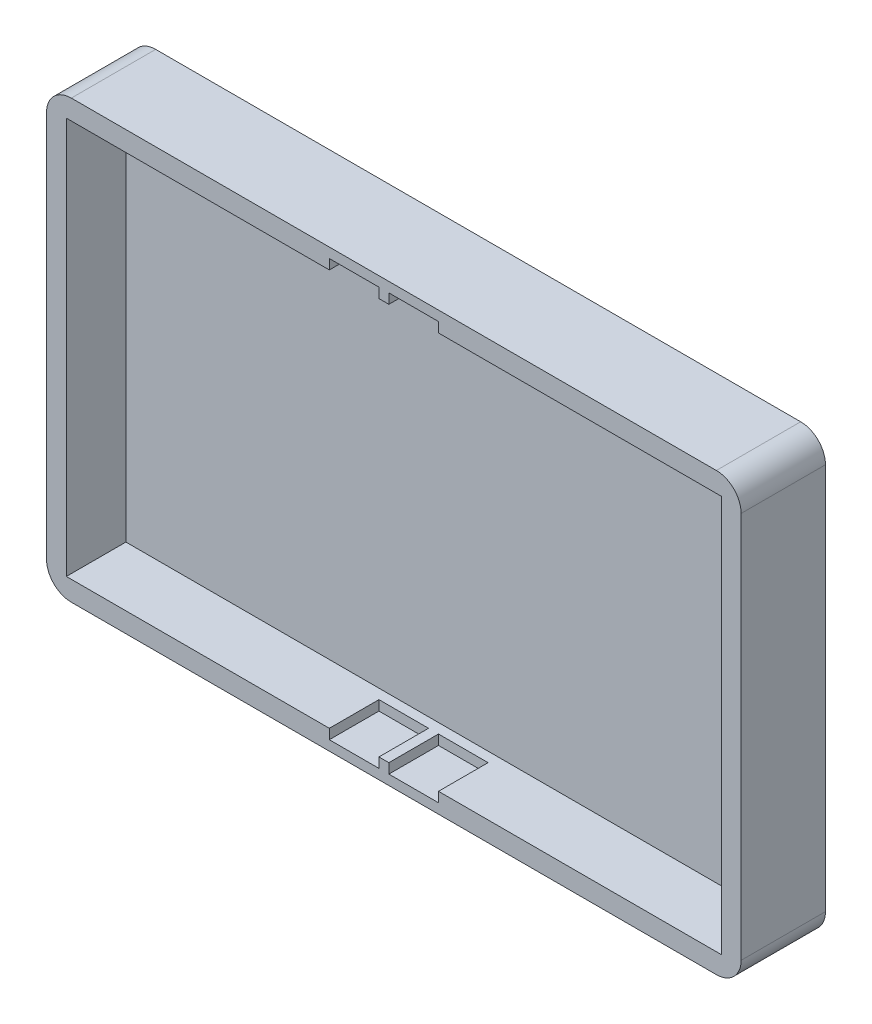
ISO-10303-21;
HEADER;
FILE_DESCRIPTION(('STEP AP214'),'2;1');
FILE_NAME('part.step','',(''),(''),'','','');
FILE_SCHEMA(('AUTOMOTIVE_DESIGN { 1 0 10303 214 1 1 1 1 }'));
ENDSEC;
DATA;
#1=APPLICATION_CONTEXT('core data for automotive mechanical design processes');
#2=APPLICATION_PROTOCOL_DEFINITION('international standard','automotive_design',2000,#1);
#3=PRODUCT_CONTEXT('',#1,'mechanical');
#4=PRODUCT('Part','Part','',(#3));
#5=PRODUCT_RELATED_PRODUCT_CATEGORY('part','',(#4));
#6=PRODUCT_DEFINITION_FORMATION('','',#4);
#7=PRODUCT_DEFINITION_CONTEXT('part definition',#1,'design');
#8=PRODUCT_DEFINITION('design','',#6,#7);
#9=PRODUCT_DEFINITION_SHAPE('','',#8);
#10=(LENGTH_UNIT() NAMED_UNIT(*) SI_UNIT(.MILLI.,.METRE.));
#11=(NAMED_UNIT(*) PLANE_ANGLE_UNIT() SI_UNIT($,.RADIAN.));
#12=(NAMED_UNIT(*) SI_UNIT($,.STERADIAN.) SOLID_ANGLE_UNIT());
#13=UNCERTAINTY_MEASURE_WITH_UNIT(LENGTH_MEASURE(1.E-05),#10,'distance_accuracy_value','');
#14=(GEOMETRIC_REPRESENTATION_CONTEXT(3) GLOBAL_UNCERTAINTY_ASSIGNED_CONTEXT((#13)) GLOBAL_UNIT_ASSIGNED_CONTEXT((#10,
#11,#12)) REPRESENTATION_CONTEXT('',''));
#15=CARTESIAN_POINT('',(0.,0.,0.));
#16=DIRECTION('',(0.,0.,1.));
#17=DIRECTION('',(1.,0.,0.));
#18=AXIS2_PLACEMENT_3D('',#15,#16,#17);
#19=CARTESIAN_POINT('',(68.,2.,2.5));
#20=DIRECTION('',(0.,-1.,0.));
#21=DIRECTION('',(1.,0.,0.));
#22=AXIS2_PLACEMENT_3D('',#19,#20,#21);
#23=PLANE('',#22);
#24=DIRECTION('',(1.,0.,0.));
#25=VECTOR('',#24,1.);
#26=CARTESIAN_POINT('',(68.,2.,8.5));
#27=LINE('',#26,#25);
#28=CARTESIAN_POINT('',(33.5,2.,8.5));
#29=VERTEX_POINT('',#28);
#30=CARTESIAN_POINT('',(34.5,2.,8.5));
#31=VERTEX_POINT('',#30);
#32=EDGE_CURVE('E406',#29,#31,#27,.T.);
#33=ORIENTED_EDGE('',*,*,#32,.T.);
#34=DIRECTION('',(0.,0.,1.));
#35=VECTOR('',#34,1.);
#36=CARTESIAN_POINT('',(34.5,2.,2.5));
#37=LINE('',#36,#35);
#38=CARTESIAN_POINT('',(34.5,2.,3.5));
#39=VERTEX_POINT('',#38);
#40=EDGE_CURVE('E358',#39,#31,#37,.T.);
#41=ORIENTED_EDGE('',*,*,#40,.F.);
#42=DIRECTION('',(-1.,0.,0.));
#43=VECTOR('',#42,1.);
#44=CARTESIAN_POINT('',(68.,2.,3.50000000000001));
#45=LINE('',#44,#43);
#46=CARTESIAN_POINT('',(39.5,2.,3.5));
#47=VERTEX_POINT('',#46);
#48=EDGE_CURVE('E355',#47,#39,#45,.T.);
#49=ORIENTED_EDGE('',*,*,#48,.F.);
#50=DIRECTION('',(0.,0.,-1.));
#51=VECTOR('',#50,1.);
#52=CARTESIAN_POINT('',(39.5,2.,2.5));
#53=LINE('',#52,#51);
#54=CARTESIAN_POINT('',(39.5,2.,8.5));
#55=VERTEX_POINT('',#54);
#56=EDGE_CURVE('E324',#55,#47,#53,.T.);
#57=ORIENTED_EDGE('',*,*,#56,.F.);
#58=CARTESIAN_POINT('',(68.,2.,8.5));
#59=VERTEX_POINT('',#58);
#60=EDGE_CURVE('E402',#55,#59,#27,.T.);
#61=ORIENTED_EDGE('',*,*,#60,.T.);
#62=DIRECTION('',(0.,0.,1.));
#63=VECTOR('',#62,1.);
#64=CARTESIAN_POINT('',(68.,2.,2.5));
#65=LINE('',#64,#63);
#66=CARTESIAN_POINT('',(68.,2.,2.5));
#67=VERTEX_POINT('',#66);
#68=EDGE_CURVE('E407',#67,#59,#65,.T.);
#69=ORIENTED_EDGE('',*,*,#68,.F.);
#70=DIRECTION('',(1.,0.,0.));
#71=VECTOR('',#70,1.);
#72=CARTESIAN_POINT('',(68.,2.,2.5));
#73=LINE('',#72,#71);
#74=CARTESIAN_POINT('',(2.,1.99999999999999,2.5));
#75=VERTEX_POINT('',#74);
#76=EDGE_CURVE('E385',#75,#67,#73,.T.);
#77=ORIENTED_EDGE('',*,*,#76,.F.);
#78=DIRECTION('',(0.,0.,1.));
#79=VECTOR('',#78,1.);
#80=CARTESIAN_POINT('',(2.,1.99999999999999,2.5));
#81=LINE('',#80,#79);
#82=CARTESIAN_POINT('',(2.,1.99999999999999,8.5));
#83=VERTEX_POINT('',#82);
#84=EDGE_CURVE('E412',#75,#83,#81,.T.);
#85=ORIENTED_EDGE('',*,*,#84,.T.);
#86=CARTESIAN_POINT('',(28.5,2.,8.5));
#87=VERTEX_POINT('',#86);
#88=EDGE_CURVE('E377',#83,#87,#27,.T.);
#89=ORIENTED_EDGE('',*,*,#88,.T.);
#90=DIRECTION('',(0.,0.,1.));
#91=VECTOR('',#90,1.);
#92=CARTESIAN_POINT('',(28.5,2.,2.5));
#93=LINE('',#92,#91);
#94=CARTESIAN_POINT('',(28.5,2.,3.5));
#95=VERTEX_POINT('',#94);
#96=EDGE_CURVE('E364',#95,#87,#93,.T.);
#97=ORIENTED_EDGE('',*,*,#96,.F.);
#98=DIRECTION('',(-1.,0.,0.));
#99=VECTOR('',#98,1.);
#100=CARTESIAN_POINT('',(68.,2.,3.50000000000001));
#101=LINE('',#100,#99);
#102=CARTESIAN_POINT('',(33.5,2.,3.5));
#103=VERTEX_POINT('',#102);
#104=EDGE_CURVE('E361',#103,#95,#101,.T.);
#105=ORIENTED_EDGE('',*,*,#104,.F.);
#106=DIRECTION('',(0.,0.,-1.));
#107=VECTOR('',#106,1.);
#108=CARTESIAN_POINT('',(33.5,2.,2.5));
#109=LINE('',#108,#107);
#110=EDGE_CURVE('E367',#29,#103,#109,.T.);
#111=ORIENTED_EDGE('',*,*,#110,.F.);
#112=EDGE_LOOP('',(#33,#41,#49,#57,#61,#69,#77,#85,#89,#97,#105,#111));
#113=FACE_BOUND('',#112,.T.);
#114=ADVANCED_FACE('F43',(#113),#23,.F.);
#115=CARTESIAN_POINT('',(68.,42.,2.5));
#116=DIRECTION('',(0.,1.,0.));
#117=DIRECTION('',(-1.,0.,0.));
#118=AXIS2_PLACEMENT_3D('',#115,#116,#117);
#119=PLANE('',#118);
#120=DIRECTION('',(0.,0.,-1.));
#121=VECTOR('',#120,1.);
#122=CARTESIAN_POINT('',(28.5,42.,2.5));
#123=LINE('',#122,#121);
#124=CARTESIAN_POINT('',(28.5,42.,8.5));
#125=VERTEX_POINT('',#124);
#126=CARTESIAN_POINT('',(28.5,42.,3.5));
#127=VERTEX_POINT('',#126);
#128=EDGE_CURVE('E463',#125,#127,#123,.T.);
#129=ORIENTED_EDGE('',*,*,#128,.F.);
#130=DIRECTION('',(-1.,0.,0.));
#131=VECTOR('',#130,1.);
#132=CARTESIAN_POINT('',(68.,42.,8.5));
#133=LINE('',#132,#131);
#134=CARTESIAN_POINT('',(2.,42.,8.5));
#135=VERTEX_POINT('',#134);
#136=EDGE_CURVE('E392',#125,#135,#133,.T.);
#137=ORIENTED_EDGE('',*,*,#136,.T.);
#138=DIRECTION('',(0.,0.,1.));
#139=VECTOR('',#138,1.);
#140=CARTESIAN_POINT('',(2.,42.,2.5));
#141=LINE('',#140,#139);
#142=CARTESIAN_POINT('',(2.,42.,2.5));
#143=VERTEX_POINT('',#142);
#144=EDGE_CURVE('E415',#143,#135,#141,.T.);
#145=ORIENTED_EDGE('',*,*,#144,.F.);
#146=DIRECTION('',(-1.,0.,0.));
#147=VECTOR('',#146,1.);
#148=CARTESIAN_POINT('',(68.,42.,2.5));
#149=LINE('',#148,#147);
#150=CARTESIAN_POINT('',(68.,42.,2.5));
#151=VERTEX_POINT('',#150);
#152=EDGE_CURVE('E376',#151,#143,#149,.T.);
#153=ORIENTED_EDGE('',*,*,#152,.F.);
#154=DIRECTION('',(0.,0.,1.));
#155=VECTOR('',#154,1.);
#156=CARTESIAN_POINT('',(68.,42.,2.5));
#157=LINE('',#156,#155);
#158=CARTESIAN_POINT('',(68.,42.,8.5));
#159=VERTEX_POINT('',#158);
#160=EDGE_CURVE('E389',#151,#159,#157,.T.);
#161=ORIENTED_EDGE('',*,*,#160,.T.);
#162=CARTESIAN_POINT('',(39.5,42.,8.5));
#163=VERTEX_POINT('',#162);
#164=EDGE_CURVE('E393',#159,#163,#133,.T.);
#165=ORIENTED_EDGE('',*,*,#164,.T.);
#166=DIRECTION('',(0.,0.,1.));
#167=VECTOR('',#166,1.);
#168=CARTESIAN_POINT('',(39.5,42.,2.5));
#169=LINE('',#168,#167);
#170=CARTESIAN_POINT('',(39.5,42.,3.5));
#171=VERTEX_POINT('',#170);
#172=EDGE_CURVE('E437',#171,#163,#169,.T.);
#173=ORIENTED_EDGE('',*,*,#172,.F.);
#174=DIRECTION('',(1.,0.,0.));
#175=VECTOR('',#174,1.);
#176=CARTESIAN_POINT('',(68.,42.,3.50000000000001));
#177=LINE('',#176,#175);
#178=CARTESIAN_POINT('',(34.5,42.,3.5));
#179=VERTEX_POINT('',#178);
#180=EDGE_CURVE('E453',#179,#171,#177,.T.);
#181=ORIENTED_EDGE('',*,*,#180,.F.);
#182=DIRECTION('',(0.,0.,-1.));
#183=VECTOR('',#182,1.);
#184=CARTESIAN_POINT('',(34.5,42.,2.5));
#185=LINE('',#184,#183);
#186=CARTESIAN_POINT('',(34.5,42.,8.5));
#187=VERTEX_POINT('',#186);
#188=EDGE_CURVE('E457',#187,#179,#185,.T.);
#189=ORIENTED_EDGE('',*,*,#188,.F.);
#190=CARTESIAN_POINT('',(33.5,42.,8.5));
#191=VERTEX_POINT('',#190);
#192=EDGE_CURVE('E398',#187,#191,#133,.T.);
#193=ORIENTED_EDGE('',*,*,#192,.T.);
#194=DIRECTION('',(0.,0.,1.));
#195=VECTOR('',#194,1.);
#196=CARTESIAN_POINT('',(33.5,42.,2.5));
#197=LINE('',#196,#195);
#198=CARTESIAN_POINT('',(33.5,42.,3.5));
#199=VERTEX_POINT('',#198);
#200=EDGE_CURVE('E250',#199,#191,#197,.T.);
#201=ORIENTED_EDGE('',*,*,#200,.F.);
#202=DIRECTION('',(1.,0.,0.));
#203=VECTOR('',#202,1.);
#204=CARTESIAN_POINT('',(68.,42.,3.50000000000001));
#205=LINE('',#204,#203);
#206=EDGE_CURVE('E460',#127,#199,#205,.T.);
#207=ORIENTED_EDGE('',*,*,#206,.F.);
#208=EDGE_LOOP('',(#129,#137,#145,#153,#161,#165,#173,#181,#189,#193,#201,#207));
#209=FACE_BOUND('',#208,.T.);
#210=ADVANCED_FACE('F536',(#209),#119,.F.);
#211=CARTESIAN_POINT('',(0.,0.,8.5));
#212=DIRECTION('',(1.,0.,0.));
#213=DIRECTION('',(0.,0.,-1.));
#214=AXIS2_PLACEMENT_3D('',#211,#212,#213);
#215=PLANE('',#214);
#216=DIRECTION('',(0.,-1.,0.));
#217=VECTOR('',#216,1.);
#218=CARTESIAN_POINT('',(0.,0.,8.5));
#219=LINE('',#218,#217);
#220=CARTESIAN_POINT('',(0.,41.5,8.5));
#221=VERTEX_POINT('',#220);
#222=CARTESIAN_POINT('',(0.,2.5,8.5));
#223=VERTEX_POINT('',#222);
#224=EDGE_CURVE('E422',#221,#223,#219,.T.);
#225=ORIENTED_EDGE('',*,*,#224,.F.);
#226=DIRECTION('',(0.,0.,-1.));
#227=VECTOR('',#226,1.);
#228=CARTESIAN_POINT('',(0.,41.5,8.5));
#229=LINE('',#228,#227);
#230=CARTESIAN_POINT('',(0.,41.5,0.));
#231=VERTEX_POINT('',#230);
#232=EDGE_CURVE('E472',#221,#231,#229,.T.);
#233=ORIENTED_EDGE('',*,*,#232,.T.);
#234=DIRECTION('',(0.,-1.,0.));
#235=VECTOR('',#234,1.);
#236=CARTESIAN_POINT('',(0.,0.,0.));
#237=LINE('',#236,#235);
#238=CARTESIAN_POINT('',(0.,2.5,0.));
#239=VERTEX_POINT('',#238);
#240=EDGE_CURVE('E411',#231,#239,#237,.T.);
#241=ORIENTED_EDGE('',*,*,#240,.T.);
#242=DIRECTION('',(0.,0.,-1.));
#243=VECTOR('',#242,1.);
#244=CARTESIAN_POINT('',(0.,2.5,8.5));
#245=LINE('',#244,#243);
#246=EDGE_CURVE('E469',#239,#223,#245,.F.);
#247=ORIENTED_EDGE('',*,*,#246,.T.);
#248=EDGE_LOOP('',(#225,#233,#241,#247));
#249=FACE_BOUND('',#248,.T.);
#250=ADVANCED_FACE('F606',(#249),#215,.F.);
#251=CARTESIAN_POINT('',(0.,0.,8.5));
#252=DIRECTION('',(0.,1.,0.));
#253=DIRECTION('',(0.,0.,1.));
#254=AXIS2_PLACEMENT_3D('',#251,#252,#253);
#255=PLANE('',#254);
#256=DIRECTION('',(1.,0.,0.));
#257=VECTOR('',#256,1.);
#258=CARTESIAN_POINT('',(0.,0.,8.5));
#259=LINE('',#258,#257);
#260=CARTESIAN_POINT('',(2.5,0.,8.5));
#261=VERTEX_POINT('',#260);
#262=CARTESIAN_POINT('',(67.5,0.,8.5));
#263=VERTEX_POINT('',#262);
#264=EDGE_CURVE('E426',#261,#263,#259,.T.);
#265=ORIENTED_EDGE('',*,*,#264,.F.);
#266=DIRECTION('',(0.,0.,-1.));
#267=VECTOR('',#266,1.);
#268=CARTESIAN_POINT('',(2.5,0.,8.5));
#269=LINE('',#268,#267);
#270=CARTESIAN_POINT('',(2.5,0.,0.));
#271=VERTEX_POINT('',#270);
#272=EDGE_CURVE('E509',#261,#271,#269,.T.);
#273=ORIENTED_EDGE('',*,*,#272,.T.);
#274=DIRECTION('',(1.,0.,0.));
#275=VECTOR('',#274,1.);
#276=CARTESIAN_POINT('',(0.,0.,0.));
#277=LINE('',#276,#275);
#278=CARTESIAN_POINT('',(67.5,0.,0.));
#279=VERTEX_POINT('',#278);
#280=EDGE_CURVE('E441',#271,#279,#277,.T.);
#281=ORIENTED_EDGE('',*,*,#280,.T.);
#282=DIRECTION('',(0.,0.,-1.));
#283=VECTOR('',#282,1.);
#284=CARTESIAN_POINT('',(67.5,0.,8.5));
#285=LINE('',#284,#283);
#286=EDGE_CURVE('E506',#279,#263,#285,.F.);
#287=ORIENTED_EDGE('',*,*,#286,.T.);
#288=EDGE_LOOP('',(#265,#273,#281,#287));
#289=FACE_BOUND('',#288,.T.);
#290=ADVANCED_FACE('F630',(#289),#255,.F.);
#291=CARTESIAN_POINT('',(70.,0.,8.5));
#292=DIRECTION('',(-1.,0.,0.));
#293=DIRECTION('',(0.,0.,1.));
#294=AXIS2_PLACEMENT_3D('',#291,#292,#293);
#295=PLANE('',#294);
#296=DIRECTION('',(0.,1.,0.));
#297=VECTOR('',#296,1.);
#298=CARTESIAN_POINT('',(70.,0.,8.5));
#299=LINE('',#298,#297);
#300=CARTESIAN_POINT('',(70.,2.5,8.5));
#301=VERTEX_POINT('',#300);
#302=CARTESIAN_POINT('',(70.,41.5,8.5));
#303=VERTEX_POINT('',#302);
#304=EDGE_CURVE('E430',#301,#303,#299,.T.);
#305=ORIENTED_EDGE('',*,*,#304,.F.);
#306=DIRECTION('',(0.,0.,-1.));
#307=VECTOR('',#306,1.);
#308=CARTESIAN_POINT('',(70.,2.5,8.5));
#309=LINE('',#308,#307);
#310=CARTESIAN_POINT('',(70.,2.5,0.));
#311=VERTEX_POINT('',#310);
#312=EDGE_CURVE('E11',#301,#311,#309,.T.);
#313=ORIENTED_EDGE('',*,*,#312,.T.);
#314=DIRECTION('',(0.,1.,0.));
#315=VECTOR('',#314,1.);
#316=CARTESIAN_POINT('',(70.,0.,0.));
#317=LINE('',#316,#315);
#318=CARTESIAN_POINT('',(70.,41.5,0.));
#319=VERTEX_POINT('',#318);
#320=EDGE_CURVE('E445',#311,#319,#317,.T.);
#321=ORIENTED_EDGE('',*,*,#320,.T.);
#322=DIRECTION('',(0.,0.,-1.));
#323=VECTOR('',#322,1.);
#324=CARTESIAN_POINT('',(70.,41.5,8.5));
#325=LINE('',#324,#323);
#326=EDGE_CURVE('E52',#319,#303,#325,.F.);
#327=ORIENTED_EDGE('',*,*,#326,.T.);
#328=EDGE_LOOP('',(#305,#313,#321,#327));
#329=FACE_BOUND('',#328,.T.);
#330=ADVANCED_FACE('F626',(#329),#295,.F.);
#331=CARTESIAN_POINT('',(0.,44.,8.5));
#332=DIRECTION('',(0.,-1.,0.));
#333=DIRECTION('',(0.,0.,-1.));
#334=AXIS2_PLACEMENT_3D('',#331,#332,#333);
#335=PLANE('',#334);
#336=DIRECTION('',(-1.,0.,0.));
#337=VECTOR('',#336,1.);
#338=CARTESIAN_POINT('',(0.,44.,0.));
#339=LINE('',#338,#337);
#340=CARTESIAN_POINT('',(67.5,44.,0.));
#341=VERTEX_POINT('',#340);
#342=CARTESIAN_POINT('',(2.5,44.,0.));
#343=VERTEX_POINT('',#342);
#344=EDGE_CURVE('E427',#341,#343,#339,.T.);
#345=ORIENTED_EDGE('',*,*,#344,.T.);
#346=DIRECTION('',(0.,0.,-1.));
#347=VECTOR('',#346,1.);
#348=CARTESIAN_POINT('',(2.5,44.,8.5));
#349=LINE('',#348,#347);
#350=CARTESIAN_POINT('',(2.5,44.,8.5));
#351=VERTEX_POINT('',#350);
#352=EDGE_CURVE('E492',#343,#351,#349,.F.);
#353=ORIENTED_EDGE('',*,*,#352,.T.);
#354=DIRECTION('',(-1.,0.,0.));
#355=VECTOR('',#354,1.);
#356=CARTESIAN_POINT('',(0.,44.,8.5));
#357=LINE('',#356,#355);
#358=CARTESIAN_POINT('',(67.5,44.,8.5));
#359=VERTEX_POINT('',#358);
#360=EDGE_CURVE('E433',#359,#351,#357,.T.);
#361=ORIENTED_EDGE('',*,*,#360,.F.);
#362=DIRECTION('',(0.,0.,-1.));
#363=VECTOR('',#362,1.);
#364=CARTESIAN_POINT('',(67.5,44.,8.5));
#365=LINE('',#364,#363);
#366=EDGE_CURVE('E488',#359,#341,#365,.T.);
#367=ORIENTED_EDGE('',*,*,#366,.T.);
#368=EDGE_LOOP('',(#345,#353,#361,#367));
#369=FACE_BOUND('',#368,.T.);
#370=ADVANCED_FACE('F620',(#369),#335,.F.);
#371=CARTESIAN_POINT('',(0.,0.,8.5));
#372=DIRECTION('',(0.,0.,-1.));
#373=DIRECTION('',(-1.,0.,0.));
#374=AXIS2_PLACEMENT_3D('',#371,#372,#373);
#375=PLANE('',#374);
#376=ORIENTED_EDGE('',*,*,#136,.F.);
#377=DIRECTION('',(0.,-1.,0.));
#378=VECTOR('',#377,1.);
#379=CARTESIAN_POINT('',(28.5,43.,8.5));
#380=LINE('',#379,#378);
#381=CARTESIAN_POINT('',(28.5,43.,8.5));
#382=VERTEX_POINT('',#381);
#383=EDGE_CURVE('E255',#382,#125,#380,.T.);
#384=ORIENTED_EDGE('',*,*,#383,.F.);
#385=DIRECTION('',(-1.,0.,0.));
#386=VECTOR('',#385,1.);
#387=CARTESIAN_POINT('',(28.5,43.,8.5));
#388=LINE('',#387,#386);
#389=CARTESIAN_POINT('',(33.5,43.,8.5));
#390=VERTEX_POINT('',#389);
#391=EDGE_CURVE('E236',#390,#382,#388,.T.);
#392=ORIENTED_EDGE('',*,*,#391,.F.);
#393=DIRECTION('',(0.,-1.,0.));
#394=VECTOR('',#393,1.);
#395=CARTESIAN_POINT('',(33.5,43.,8.5));
#396=LINE('',#395,#394);
#397=EDGE_CURVE('E247',#390,#191,#396,.T.);
#398=ORIENTED_EDGE('',*,*,#397,.T.);
#399=ORIENTED_EDGE('',*,*,#192,.F.);
#400=DIRECTION('',(0.,-1.,0.));
#401=VECTOR('',#400,1.);
#402=CARTESIAN_POINT('',(34.5,43.,8.5));
#403=LINE('',#402,#401);
#404=CARTESIAN_POINT('',(34.5,43.,8.5));
#405=VERTEX_POINT('',#404);
#406=EDGE_CURVE('E282',#405,#187,#403,.T.);
#407=ORIENTED_EDGE('',*,*,#406,.F.);
#408=DIRECTION('',(-1.,0.,0.));
#409=VECTOR('',#408,1.);
#410=CARTESIAN_POINT('',(39.5,43.,8.5));
#411=LINE('',#410,#409);
#412=CARTESIAN_POINT('',(39.5,43.,8.5));
#413=VERTEX_POINT('',#412);
#414=EDGE_CURVE('E274',#413,#405,#411,.T.);
#415=ORIENTED_EDGE('',*,*,#414,.F.);
#416=DIRECTION('',(0.,-1.,0.));
#417=VECTOR('',#416,1.);
#418=CARTESIAN_POINT('',(39.5,43.,8.5));
#419=LINE('',#418,#417);
#420=EDGE_CURVE('E281',#413,#163,#419,.T.);
#421=ORIENTED_EDGE('',*,*,#420,.T.);
#422=ORIENTED_EDGE('',*,*,#164,.F.);
#423=DIRECTION('',(0.,1.,0.));
#424=VECTOR('',#423,1.);
#425=CARTESIAN_POINT('',(68.,42.,8.5));
#426=LINE('',#425,#424);
#427=EDGE_CURVE('E371',#59,#159,#426,.T.);
#428=ORIENTED_EDGE('',*,*,#427,.F.);
#429=ORIENTED_EDGE('',*,*,#60,.F.);
#430=DIRECTION('',(0.,1.,0.));
#431=VECTOR('',#430,1.);
#432=CARTESIAN_POINT('',(39.5,0.999999999999997,8.5));
#433=LINE('',#432,#431);
#434=CARTESIAN_POINT('',(39.5,0.999999999999997,8.5));
#435=VERTEX_POINT('',#434);
#436=EDGE_CURVE('E270',#435,#55,#433,.T.);
#437=ORIENTED_EDGE('',*,*,#436,.F.);
#438=DIRECTION('',(1.,0.,0.));
#439=VECTOR('',#438,1.);
#440=CARTESIAN_POINT('',(34.5,0.999999999999996,8.5));
#441=LINE('',#440,#439);
#442=CARTESIAN_POINT('',(34.5,0.999999999999996,8.5));
#443=VERTEX_POINT('',#442);
#444=EDGE_CURVE('E264',#443,#435,#441,.T.);
#445=ORIENTED_EDGE('',*,*,#444,.F.);
#446=DIRECTION('',(0.,1.,0.));
#447=VECTOR('',#446,1.);
#448=CARTESIAN_POINT('',(34.5,0.999999999999996,8.5));
#449=LINE('',#448,#447);
#450=EDGE_CURVE('E269',#443,#31,#449,.T.);
#451=ORIENTED_EDGE('',*,*,#450,.T.);
#452=ORIENTED_EDGE('',*,*,#32,.F.);
#453=DIRECTION('',(0.,1.,0.));
#454=VECTOR('',#453,1.);
#455=CARTESIAN_POINT('',(33.5,0.999999999999996,8.5));
#456=LINE('',#455,#454);
#457=CARTESIAN_POINT('',(33.5,0.999999999999996,8.5));
#458=VERTEX_POINT('',#457);
#459=EDGE_CURVE('E294',#458,#29,#456,.T.);
#460=ORIENTED_EDGE('',*,*,#459,.F.);
#461=DIRECTION('',(1.,0.,0.));
#462=VECTOR('',#461,1.);
#463=CARTESIAN_POINT('',(28.5,0.999999999999995,8.5));
#464=LINE('',#463,#462);
#465=CARTESIAN_POINT('',(28.5,0.999999999999995,8.5));
#466=VERTEX_POINT('',#465);
#467=EDGE_CURVE('E286',#466,#458,#464,.T.);
#468=ORIENTED_EDGE('',*,*,#467,.F.);
#469=DIRECTION('',(0.,1.,0.));
#470=VECTOR('',#469,1.);
#471=CARTESIAN_POINT('',(28.5,0.999999999999995,8.5));
#472=LINE('',#471,#470);
#473=EDGE_CURVE('E293',#466,#87,#472,.T.);
#474=ORIENTED_EDGE('',*,*,#473,.T.);
#475=ORIENTED_EDGE('',*,*,#88,.F.);
#476=DIRECTION('',(0.,-1.,0.));
#477=VECTOR('',#476,1.);
#478=CARTESIAN_POINT('',(2.,42.,8.5));
#479=LINE('',#478,#477);
#480=EDGE_CURVE('E397',#135,#83,#479,.T.);
#481=ORIENTED_EDGE('',*,*,#480,.F.);
#482=EDGE_LOOP('',(#376,#384,#392,#398,#399,#407,#415,#421,#422,#428,#429,#437,#445,#451,#452,
#460,#468,#474,#475,#481));
#483=FACE_BOUND('',#482,.T.);
#484=ORIENTED_EDGE('',*,*,#360,.T.);
#485=CARTESIAN_POINT('',(2.5,41.5,8.5));
#486=DIRECTION('',(0.,0.,-1.));
#487=DIRECTION('',(-1.,0.,0.));
#488=AXIS2_PLACEMENT_3D('',#485,#486,#487);
#489=CIRCLE('',#488,2.5);
#490=EDGE_CURVE('E503',#351,#221,#489,.F.);
#491=ORIENTED_EDGE('',*,*,#490,.T.);
#492=ORIENTED_EDGE('',*,*,#224,.T.);
#493=CARTESIAN_POINT('',(2.5,2.5,8.5));
#494=DIRECTION('',(0.,0.,-1.));
#495=DIRECTION('',(-1.,0.,0.));
#496=AXIS2_PLACEMENT_3D('',#493,#494,#495);
#497=CIRCLE('',#496,2.5);
#498=EDGE_CURVE('E500',#223,#261,#497,.F.);
#499=ORIENTED_EDGE('',*,*,#498,.T.);
#500=ORIENTED_EDGE('',*,*,#264,.T.);
#501=CARTESIAN_POINT('',(67.5,2.5,8.5));
#502=DIRECTION('',(0.,0.,-1.));
#503=DIRECTION('',(-1.,0.,0.));
#504=AXIS2_PLACEMENT_3D('',#501,#502,#503);
#505=CIRCLE('',#504,2.5);
#506=EDGE_CURVE('E65',#263,#301,#505,.F.);
#507=ORIENTED_EDGE('',*,*,#506,.T.);
#508=ORIENTED_EDGE('',*,*,#304,.T.);
#509=CARTESIAN_POINT('',(67.5,41.5,8.5));
#510=DIRECTION('',(0.,0.,-1.));
#511=DIRECTION('',(-1.,0.,0.));
#512=AXIS2_PLACEMENT_3D('',#509,#510,#511);
#513=CIRCLE('',#512,2.5);
#514=EDGE_CURVE('E495',#303,#359,#513,.F.);
#515=ORIENTED_EDGE('',*,*,#514,.T.);
#516=EDGE_LOOP('',(#484,#491,#492,#499,#500,#507,#508,#515));
#517=FACE_BOUND('',#516,.T.);
#518=ADVANCED_FACE('F258',(#483,#517),#375,.F.);
#519=CARTESIAN_POINT('',(0.,0.,0.));
#520=DIRECTION('',(0.,0.,-1.));
#521=DIRECTION('',(-1.,0.,0.));
#522=AXIS2_PLACEMENT_3D('',#519,#520,#521);
#523=PLANE('',#522);
#524=ORIENTED_EDGE('',*,*,#240,.F.);
#525=CARTESIAN_POINT('',(2.5,41.5,0.));
#526=DIRECTION('',(0.,0.,-1.));
#527=DIRECTION('',(-1.,0.,0.));
#528=AXIS2_PLACEMENT_3D('',#525,#526,#527);
#529=CIRCLE('',#528,2.5);
#530=EDGE_CURVE('E485',#231,#343,#529,.T.);
#531=ORIENTED_EDGE('',*,*,#530,.T.);
#532=ORIENTED_EDGE('',*,*,#344,.F.);
#533=CARTESIAN_POINT('',(67.5,41.5,0.));
#534=DIRECTION('',(0.,0.,-1.));
#535=DIRECTION('',(-1.,0.,0.));
#536=AXIS2_PLACEMENT_3D('',#533,#534,#535);
#537=CIRCLE('',#536,2.5);
#538=EDGE_CURVE('E476',#341,#319,#537,.T.);
#539=ORIENTED_EDGE('',*,*,#538,.T.);
#540=ORIENTED_EDGE('',*,*,#320,.F.);
#541=CARTESIAN_POINT('',(67.5,2.5,0.));
#542=DIRECTION('',(0.,0.,-1.));
#543=DIRECTION('',(-1.,0.,0.));
#544=AXIS2_PLACEMENT_3D('',#541,#542,#543);
#545=CIRCLE('',#544,2.5);
#546=EDGE_CURVE('E479',#311,#279,#545,.T.);
#547=ORIENTED_EDGE('',*,*,#546,.T.);
#548=ORIENTED_EDGE('',*,*,#280,.F.);
#549=CARTESIAN_POINT('',(2.5,2.5,0.));
#550=DIRECTION('',(0.,0.,-1.));
#551=DIRECTION('',(-1.,0.,0.));
#552=AXIS2_PLACEMENT_3D('',#549,#550,#551);
#553=CIRCLE('',#552,2.5);
#554=EDGE_CURVE('E482',#271,#239,#553,.T.);
#555=ORIENTED_EDGE('',*,*,#554,.T.);
#556=EDGE_LOOP('',(#524,#531,#532,#539,#540,#547,#548,#555));
#557=FACE_BOUND('',#556,.T.);
#558=ADVANCED_FACE('F617',(#557),#523,.T.);
#559=CARTESIAN_POINT('',(68.,42.,2.5));
#560=DIRECTION('',(1.,0.,0.));
#561=DIRECTION('',(0.,0.,-1.));
#562=AXIS2_PLACEMENT_3D('',#559,#560,#561);
#563=PLANE('',#562);
#564=ORIENTED_EDGE('',*,*,#427,.T.);
#565=ORIENTED_EDGE('',*,*,#160,.F.);
#566=DIRECTION('',(0.,1.,0.));
#567=VECTOR('',#566,1.);
#568=CARTESIAN_POINT('',(68.,42.,2.5));
#569=LINE('',#568,#567);
#570=EDGE_CURVE('E372',#67,#151,#569,.T.);
#571=ORIENTED_EDGE('',*,*,#570,.F.);
#572=ORIENTED_EDGE('',*,*,#68,.T.);
#573=EDGE_LOOP('',(#564,#565,#571,#572));
#574=FACE_BOUND('',#573,.T.);
#575=ADVANCED_FACE('F546',(#574),#563,.F.);
#576=CARTESIAN_POINT('',(2.,42.,2.5));
#577=DIRECTION('',(-1.,0.,0.));
#578=DIRECTION('',(0.,0.,1.));
#579=AXIS2_PLACEMENT_3D('',#576,#577,#578);
#580=PLANE('',#579);
#581=ORIENTED_EDGE('',*,*,#480,.T.);
#582=ORIENTED_EDGE('',*,*,#84,.F.);
#583=DIRECTION('',(0.,-1.,0.));
#584=VECTOR('',#583,1.);
#585=CARTESIAN_POINT('',(2.,42.,2.5));
#586=LINE('',#585,#584);
#587=EDGE_CURVE('E381',#143,#75,#586,.T.);
#588=ORIENTED_EDGE('',*,*,#587,.F.);
#589=ORIENTED_EDGE('',*,*,#144,.T.);
#590=EDGE_LOOP('',(#581,#582,#588,#589));
#591=FACE_BOUND('',#590,.T.);
#592=ADVANCED_FACE('F611',(#591),#580,.F.);
#593=CARTESIAN_POINT('',(0.,0.,2.5));
#594=DIRECTION('',(0.,0.,-1.));
#595=DIRECTION('',(-1.,0.,0.));
#596=AXIS2_PLACEMENT_3D('',#593,#594,#595);
#597=PLANE('',#596);
#598=ORIENTED_EDGE('',*,*,#570,.T.);
#599=ORIENTED_EDGE('',*,*,#152,.T.);
#600=ORIENTED_EDGE('',*,*,#587,.T.);
#601=ORIENTED_EDGE('',*,*,#76,.T.);
#602=EDGE_LOOP('',(#598,#599,#600,#601));
#603=FACE_BOUND('',#602,.T.);
#604=ADVANCED_FACE('F551',(#603),#597,.F.);
#605=CARTESIAN_POINT('',(0.,43.,0.));
#606=DIRECTION('',(0.,-1.,0.));
#607=DIRECTION('',(0.,0.,-1.));
#608=AXIS2_PLACEMENT_3D('',#605,#606,#607);
#609=PLANE('',#608);
#610=DIRECTION('',(0.,0.,1.));
#611=VECTOR('',#610,1.);
#612=CARTESIAN_POINT('',(39.5,43.,7.5));
#613=LINE('',#612,#611);
#614=CARTESIAN_POINT('',(39.5,43.,3.5));
#615=VERTEX_POINT('',#614);
#616=EDGE_CURVE('E343',#615,#413,#613,.T.);
#617=ORIENTED_EDGE('',*,*,#616,.T.);
#618=ORIENTED_EDGE('',*,*,#414,.T.);
#619=DIRECTION('',(0.,0.,-1.));
#620=VECTOR('',#619,1.);
#621=CARTESIAN_POINT('',(34.5,43.,7.5));
#622=LINE('',#621,#620);
#623=CARTESIAN_POINT('',(34.5,43.,3.5));
#624=VERTEX_POINT('',#623);
#625=EDGE_CURVE('E244',#405,#624,#622,.T.);
#626=ORIENTED_EDGE('',*,*,#625,.T.);
#627=DIRECTION('',(1.,0.,0.));
#628=VECTOR('',#627,1.);
#629=CARTESIAN_POINT('',(39.5,43.,3.5));
#630=LINE('',#629,#628);
#631=EDGE_CURVE('E346',#624,#615,#630,.T.);
#632=ORIENTED_EDGE('',*,*,#631,.T.);
#633=EDGE_LOOP('',(#617,#618,#626,#632));
#634=FACE_BOUND('',#633,.T.);
#635=ADVANCED_FACE('F531',(#634),#609,.T.);
#636=CARTESIAN_POINT('',(39.5,0.999999999999973,7.5));
#637=DIRECTION('',(-1.,0.,0.));
#638=DIRECTION('',(0.,-1.,0.));
#639=AXIS2_PLACEMENT_3D('',#636,#637,#638);
#640=PLANE('',#639);
#641=ORIENTED_EDGE('',*,*,#172,.T.);
#642=ORIENTED_EDGE('',*,*,#420,.F.);
#643=ORIENTED_EDGE('',*,*,#616,.F.);
#644=DIRECTION('',(0.,1.,0.));
#645=VECTOR('',#644,1.);
#646=CARTESIAN_POINT('',(39.5,0.999999999999973,3.5));
#647=LINE('',#646,#645);
#648=EDGE_CURVE('E329',#171,#615,#647,.T.);
#649=ORIENTED_EDGE('',*,*,#648,.F.);
#650=EDGE_LOOP('',(#641,#642,#643,#649));
#651=FACE_BOUND('',#650,.T.);
#652=ADVANCED_FACE('F541',(#651),#640,.T.);
#653=CARTESIAN_POINT('',(39.5,0.999999999999973,3.5));
#654=DIRECTION('',(0.,0.,1.));
#655=DIRECTION('',(1.,0.,0.));
#656=AXIS2_PLACEMENT_3D('',#653,#654,#655);
#657=PLANE('',#656);
#658=ORIENTED_EDGE('',*,*,#180,.T.);
#659=ORIENTED_EDGE('',*,*,#648,.T.);
#660=ORIENTED_EDGE('',*,*,#631,.F.);
#661=DIRECTION('',(0.,1.,0.));
#662=VECTOR('',#661,1.);
#663=CARTESIAN_POINT('',(34.5,0.999999999999973,3.5));
#664=LINE('',#663,#662);
#665=EDGE_CURVE('E298',#179,#624,#664,.T.);
#666=ORIENTED_EDGE('',*,*,#665,.F.);
#667=EDGE_LOOP('',(#658,#659,#660,#666));
#668=FACE_BOUND('',#667,.T.);
#669=ADVANCED_FACE('F528',(#668),#657,.T.);
#670=CARTESIAN_POINT('',(34.5,0.999999999999973,7.5));
#671=DIRECTION('',(1.,0.,0.));
#672=DIRECTION('',(0.,1.,0.));
#673=AXIS2_PLACEMENT_3D('',#670,#671,#672);
#674=PLANE('',#673);
#675=ORIENTED_EDGE('',*,*,#188,.T.);
#676=ORIENTED_EDGE('',*,*,#665,.T.);
#677=ORIENTED_EDGE('',*,*,#625,.F.);
#678=ORIENTED_EDGE('',*,*,#406,.T.);
#679=EDGE_LOOP('',(#675,#676,#677,#678));
#680=FACE_BOUND('',#679,.T.);
#681=ADVANCED_FACE('F525',(#680),#674,.T.);
#682=CARTESIAN_POINT('',(0.,43.,0.));
#683=DIRECTION('',(0.,1.,0.));
#684=DIRECTION('',(-1.,0.,0.));
#685=AXIS2_PLACEMENT_3D('',#682,#683,#684);
#686=PLANE('',#685);
#687=DIRECTION('',(0.,0.,1.));
#688=VECTOR('',#687,1.);
#689=CARTESIAN_POINT('',(33.5,43.,7.5));
#690=LINE('',#689,#688);
#691=CARTESIAN_POINT('',(33.5,43.,3.5));
#692=VERTEX_POINT('',#691);
#693=EDGE_CURVE('E231',#692,#390,#690,.T.);
#694=ORIENTED_EDGE('',*,*,#693,.T.);
#695=ORIENTED_EDGE('',*,*,#391,.T.);
#696=DIRECTION('',(0.,0.,-1.));
#697=VECTOR('',#696,1.);
#698=CARTESIAN_POINT('',(28.5,43.,7.5));
#699=LINE('',#698,#697);
#700=CARTESIAN_POINT('',(28.5,43.,3.5));
#701=VERTEX_POINT('',#700);
#702=EDGE_CURVE('E243',#382,#701,#699,.T.);
#703=ORIENTED_EDGE('',*,*,#702,.T.);
#704=DIRECTION('',(1.,0.,0.));
#705=VECTOR('',#704,1.);
#706=CARTESIAN_POINT('',(33.5,43.,3.5));
#707=LINE('',#706,#705);
#708=EDGE_CURVE('E239',#701,#692,#707,.T.);
#709=ORIENTED_EDGE('',*,*,#708,.T.);
#710=EDGE_LOOP('',(#694,#695,#703,#709));
#711=FACE_BOUND('',#710,.T.);
#712=ADVANCED_FACE('F233',(#711),#686,.F.);
#713=CARTESIAN_POINT('',(33.5,0.999999999999973,3.5));
#714=DIRECTION('',(0.,0.,1.));
#715=DIRECTION('',(1.,0.,0.));
#716=AXIS2_PLACEMENT_3D('',#713,#714,#715);
#717=PLANE('',#716);
#718=ORIENTED_EDGE('',*,*,#206,.T.);
#719=DIRECTION('',(0.,1.,0.));
#720=VECTOR('',#719,1.);
#721=CARTESIAN_POINT('',(33.5,0.999999999999973,3.5));
#722=LINE('',#721,#720);
#723=EDGE_CURVE('E315',#199,#692,#722,.T.);
#724=ORIENTED_EDGE('',*,*,#723,.T.);
#725=ORIENTED_EDGE('',*,*,#708,.F.);
#726=DIRECTION('',(0.,1.,0.));
#727=VECTOR('',#726,1.);
#728=CARTESIAN_POINT('',(28.5,0.999999999999966,3.5));
#729=LINE('',#728,#727);
#730=EDGE_CURVE('E319',#127,#701,#729,.T.);
#731=ORIENTED_EDGE('',*,*,#730,.F.);
#732=EDGE_LOOP('',(#718,#724,#725,#731));
#733=FACE_BOUND('',#732,.T.);
#734=ADVANCED_FACE('F590',(#733),#717,.T.);
#735=CARTESIAN_POINT('',(28.5,0.999999999999966,7.5));
#736=DIRECTION('',(1.,0.,0.));
#737=DIRECTION('',(0.,1.,0.));
#738=AXIS2_PLACEMENT_3D('',#735,#736,#737);
#739=PLANE('',#738);
#740=ORIENTED_EDGE('',*,*,#128,.T.);
#741=ORIENTED_EDGE('',*,*,#730,.T.);
#742=ORIENTED_EDGE('',*,*,#702,.F.);
#743=ORIENTED_EDGE('',*,*,#383,.T.);
#744=EDGE_LOOP('',(#740,#741,#742,#743));
#745=FACE_BOUND('',#744,.T.);
#746=ADVANCED_FACE('F598',(#745),#739,.T.);
#747=CARTESIAN_POINT('',(33.5,0.999999999999973,7.5));
#748=DIRECTION('',(-1.,0.,0.));
#749=DIRECTION('',(0.,-1.,0.));
#750=AXIS2_PLACEMENT_3D('',#747,#748,#749);
#751=PLANE('',#750);
#752=ORIENTED_EDGE('',*,*,#200,.T.);
#753=ORIENTED_EDGE('',*,*,#397,.F.);
#754=ORIENTED_EDGE('',*,*,#693,.F.);
#755=ORIENTED_EDGE('',*,*,#723,.F.);
#756=EDGE_LOOP('',(#752,#753,#754,#755));
#757=FACE_BOUND('',#756,.T.);
#758=ADVANCED_FACE('F248',(#757),#751,.T.);
#759=ORIENTED_EDGE('',*,*,#40,.T.);
#760=ORIENTED_EDGE('',*,*,#450,.F.);
#761=DIRECTION('',(0.,0.,-1.));
#762=VECTOR('',#761,1.);
#763=CARTESIAN_POINT('',(34.5,0.999999999999973,7.5));
#764=LINE('',#763,#762);
#765=CARTESIAN_POINT('',(34.5,0.999999999999973,3.5));
#766=VERTEX_POINT('',#765);
#767=EDGE_CURVE('E340',#443,#766,#764,.T.);
#768=ORIENTED_EDGE('',*,*,#767,.T.);
#769=EDGE_CURVE('E325',#766,#39,#664,.T.);
#770=ORIENTED_EDGE('',*,*,#769,.T.);
#771=EDGE_LOOP('',(#759,#760,#768,#770));
#772=FACE_BOUND('',#771,.T.);
#773=ADVANCED_FACE('F568',(#772),#674,.T.);
#774=ORIENTED_EDGE('',*,*,#48,.T.);
#775=ORIENTED_EDGE('',*,*,#769,.F.);
#776=DIRECTION('',(1.,0.,0.));
#777=VECTOR('',#776,1.);
#778=CARTESIAN_POINT('',(39.5,0.999999999999973,3.5));
#779=LINE('',#778,#777);
#780=CARTESIAN_POINT('',(39.5,0.999999999999973,3.5));
#781=VERTEX_POINT('',#780);
#782=EDGE_CURVE('E337',#766,#781,#779,.T.);
#783=ORIENTED_EDGE('',*,*,#782,.T.);
#784=EDGE_CURVE('E330',#781,#47,#647,.T.);
#785=ORIENTED_EDGE('',*,*,#784,.T.);
#786=EDGE_LOOP('',(#774,#775,#783,#785));
#787=FACE_BOUND('',#786,.T.);
#788=ADVANCED_FACE('F741',(#787),#657,.T.);
#789=ORIENTED_EDGE('',*,*,#56,.T.);
#790=ORIENTED_EDGE('',*,*,#784,.F.);
#791=DIRECTION('',(0.,0.,1.));
#792=VECTOR('',#791,1.);
#793=CARTESIAN_POINT('',(39.5,0.999999999999973,7.5));
#794=LINE('',#793,#792);
#795=EDGE_CURVE('E334',#781,#435,#794,.T.);
#796=ORIENTED_EDGE('',*,*,#795,.T.);
#797=ORIENTED_EDGE('',*,*,#436,.T.);
#798=EDGE_LOOP('',(#789,#790,#796,#797));
#799=FACE_BOUND('',#798,.T.);
#800=ADVANCED_FACE('F558',(#799),#640,.T.);
#801=CARTESIAN_POINT('',(0.,0.999999999999973,0.));
#802=DIRECTION('',(0.,-1.,0.));
#803=DIRECTION('',(0.,0.,-1.));
#804=AXIS2_PLACEMENT_3D('',#801,#802,#803);
#805=PLANE('',#804);
#806=ORIENTED_EDGE('',*,*,#767,.F.);
#807=ORIENTED_EDGE('',*,*,#444,.T.);
#808=ORIENTED_EDGE('',*,*,#795,.F.);
#809=ORIENTED_EDGE('',*,*,#782,.F.);
#810=EDGE_LOOP('',(#806,#807,#808,#809));
#811=FACE_BOUND('',#810,.T.);
#812=ADVANCED_FACE('F564',(#811),#805,.F.);
#813=ORIENTED_EDGE('',*,*,#110,.T.);
#814=CARTESIAN_POINT('',(33.5,0.999999999999973,3.5));
#815=VERTEX_POINT('',#814);
#816=EDGE_CURVE('E316',#815,#103,#722,.T.);
#817=ORIENTED_EDGE('',*,*,#816,.F.);
#818=DIRECTION('',(0.,0.,1.));
#819=VECTOR('',#818,1.);
#820=CARTESIAN_POINT('',(33.5,0.999999999999973,7.5));
#821=LINE('',#820,#819);
#822=EDGE_CURVE('E306',#815,#458,#821,.T.);
#823=ORIENTED_EDGE('',*,*,#822,.T.);
#824=ORIENTED_EDGE('',*,*,#459,.T.);
#825=EDGE_LOOP('',(#813,#817,#823,#824));
#826=FACE_BOUND('',#825,.T.);
#827=ADVANCED_FACE('F573',(#826),#751,.T.);
#828=ORIENTED_EDGE('',*,*,#96,.T.);
#829=ORIENTED_EDGE('',*,*,#473,.F.);
#830=DIRECTION('',(0.,0.,-1.));
#831=VECTOR('',#830,1.);
#832=CARTESIAN_POINT('',(28.5,0.999999999999966,7.5));
#833=LINE('',#832,#831);
#834=CARTESIAN_POINT('',(28.5,0.999999999999966,3.5));
#835=VERTEX_POINT('',#834);
#836=EDGE_CURVE('E309',#466,#835,#833,.T.);
#837=ORIENTED_EDGE('',*,*,#836,.T.);
#838=EDGE_CURVE('E320',#835,#95,#729,.T.);
#839=ORIENTED_EDGE('',*,*,#838,.T.);
#840=EDGE_LOOP('',(#828,#829,#837,#839));
#841=FACE_BOUND('',#840,.T.);
#842=ADVANCED_FACE('F582',(#841),#739,.T.);
#843=ORIENTED_EDGE('',*,*,#104,.T.);
#844=ORIENTED_EDGE('',*,*,#838,.F.);
#845=DIRECTION('',(1.,0.,0.));
#846=VECTOR('',#845,1.);
#847=CARTESIAN_POINT('',(33.5,0.999999999999973,3.5));
#848=LINE('',#847,#846);
#849=EDGE_CURVE('E312',#835,#815,#848,.T.);
#850=ORIENTED_EDGE('',*,*,#849,.T.);
#851=ORIENTED_EDGE('',*,*,#816,.T.);
#852=EDGE_LOOP('',(#843,#844,#850,#851));
#853=FACE_BOUND('',#852,.T.);
#854=ADVANCED_FACE('F587',(#853),#717,.T.);
#855=CARTESIAN_POINT('',(0.,0.999999999999925,0.));
#856=DIRECTION('',(0.,1.,0.));
#857=DIRECTION('',(-1.,0.,0.));
#858=AXIS2_PLACEMENT_3D('',#855,#856,#857);
#859=PLANE('',#858);
#860=ORIENTED_EDGE('',*,*,#822,.F.);
#861=ORIENTED_EDGE('',*,*,#849,.F.);
#862=ORIENTED_EDGE('',*,*,#836,.F.);
#863=ORIENTED_EDGE('',*,*,#467,.T.);
#864=EDGE_LOOP('',(#860,#861,#862,#863));
#865=FACE_BOUND('',#864,.T.);
#866=ADVANCED_FACE('F578',(#865),#859,.T.);
#867=CARTESIAN_POINT('',(2.5,41.5,8.5));
#868=DIRECTION('',(0.,0.,-1.));
#869=DIRECTION('',(-1.,0.,0.));
#870=AXIS2_PLACEMENT_3D('',#867,#868,#869);
#871=CYLINDRICAL_SURFACE('',#870,2.5);
#872=ORIENTED_EDGE('',*,*,#490,.F.);
#873=ORIENTED_EDGE('',*,*,#352,.F.);
#874=ORIENTED_EDGE('',*,*,#530,.F.);
#875=ORIENTED_EDGE('',*,*,#232,.F.);
#876=EDGE_LOOP('',(#872,#873,#874,#875));
#877=FACE_BOUND('',#876,.T.);
#878=ADVANCED_FACE('F595',(#877),#871,.T.);
#879=CARTESIAN_POINT('',(2.5,2.5,8.5));
#880=DIRECTION('',(0.,0.,-1.));
#881=DIRECTION('',(-1.,0.,0.));
#882=AXIS2_PLACEMENT_3D('',#879,#880,#881);
#883=CYLINDRICAL_SURFACE('',#882,2.5);
#884=ORIENTED_EDGE('',*,*,#498,.F.);
#885=ORIENTED_EDGE('',*,*,#246,.F.);
#886=ORIENTED_EDGE('',*,*,#554,.F.);
#887=ORIENTED_EDGE('',*,*,#272,.F.);
#888=EDGE_LOOP('',(#884,#885,#886,#887));
#889=FACE_BOUND('',#888,.T.);
#890=ADVANCED_FACE('F639',(#889),#883,.T.);
#891=CARTESIAN_POINT('',(67.5,2.5,8.5));
#892=DIRECTION('',(0.,0.,-1.));
#893=DIRECTION('',(-1.,0.,0.));
#894=AXIS2_PLACEMENT_3D('',#891,#892,#893);
#895=CYLINDRICAL_SURFACE('',#894,2.5);
#896=ORIENTED_EDGE('',*,*,#506,.F.);
#897=ORIENTED_EDGE('',*,*,#286,.F.);
#898=ORIENTED_EDGE('',*,*,#546,.F.);
#899=ORIENTED_EDGE('',*,*,#312,.F.);
#900=EDGE_LOOP('',(#896,#897,#898,#899));
#901=FACE_BOUND('',#900,.T.);
#902=ADVANCED_FACE('F642',(#901),#895,.T.);
#903=CARTESIAN_POINT('',(67.5,41.5,8.5));
#904=DIRECTION('',(0.,0.,-1.));
#905=DIRECTION('',(-1.,0.,0.));
#906=AXIS2_PLACEMENT_3D('',#903,#904,#905);
#907=CYLINDRICAL_SURFACE('',#906,2.5);
#908=ORIENTED_EDGE('',*,*,#514,.F.);
#909=ORIENTED_EDGE('',*,*,#326,.F.);
#910=ORIENTED_EDGE('',*,*,#538,.F.);
#911=ORIENTED_EDGE('',*,*,#366,.F.);
#912=EDGE_LOOP('',(#908,#909,#910,#911));
#913=FACE_BOUND('',#912,.T.);
#914=ADVANCED_FACE('F45',(#913),#907,.T.);
#915=CLOSED_SHELL('',(#114,#210,#250,#290,#330,#370,#518,#558,#575,#592,#604,#635,#652,#669,
#681,#712,#734,#746,#758,#773,#788,#800,#812,#827,#842,#854,#866,#878,#890,#902,#914));
#916=MANIFOLD_SOLID_BREP('B2',#915);
#917=ADVANCED_BREP_SHAPE_REPRESENTATION('',(#18,#916),#14);
#918=SHAPE_DEFINITION_REPRESENTATION(#9,#917);
ENDSEC;
END-ISO-10303-21;
